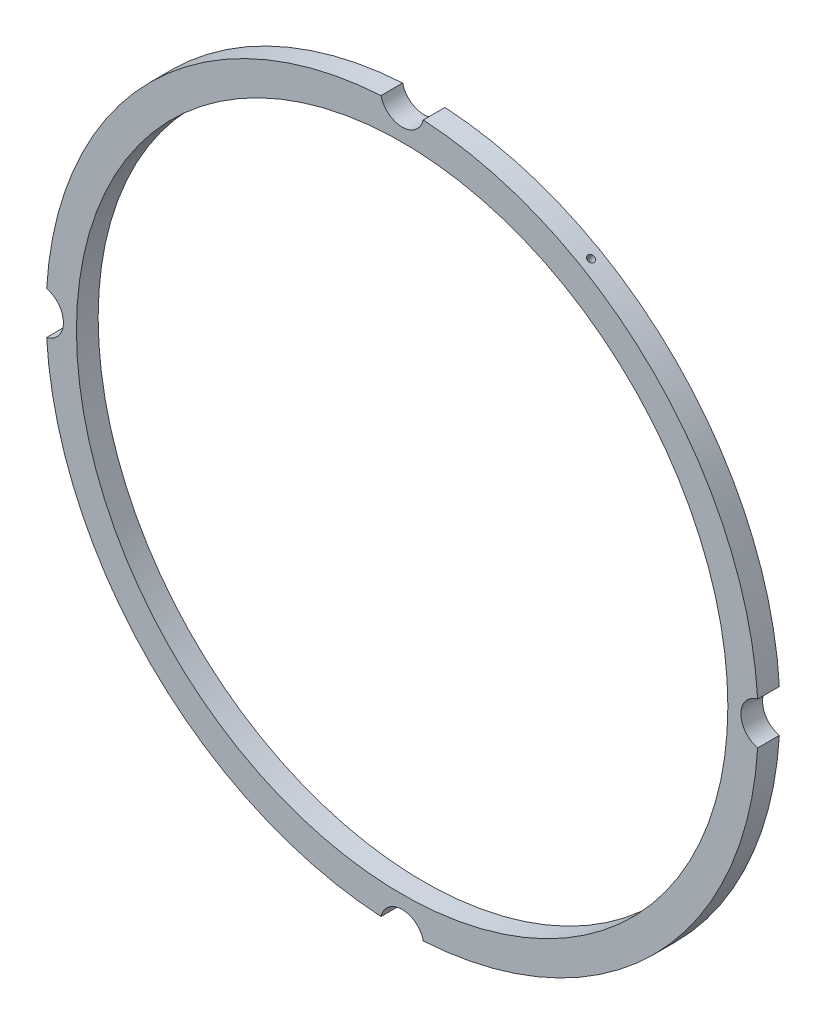
ISO-10303-21;
HEADER;
FILE_DESCRIPTION(('STEP AP214'),'2;1');
FILE_NAME('part.step','',(''),(''),'','','');
FILE_SCHEMA(('AUTOMOTIVE_DESIGN { 1 0 10303 214 1 1 1 1 }'));
ENDSEC;
DATA;
#1=APPLICATION_CONTEXT('core data for automotive mechanical design processes');
#2=APPLICATION_PROTOCOL_DEFINITION('international standard','automotive_design',2000,#1);
#3=PRODUCT_CONTEXT('',#1,'mechanical');
#4=PRODUCT('Part','Part','',(#3));
#5=PRODUCT_RELATED_PRODUCT_CATEGORY('part','',(#4));
#6=PRODUCT_DEFINITION_FORMATION('','',#4);
#7=PRODUCT_DEFINITION_CONTEXT('part definition',#1,'design');
#8=PRODUCT_DEFINITION('design','',#6,#7);
#9=PRODUCT_DEFINITION_SHAPE('','',#8);
#10=(LENGTH_UNIT() NAMED_UNIT(*) SI_UNIT(.MILLI.,.METRE.));
#11=(NAMED_UNIT(*) PLANE_ANGLE_UNIT() SI_UNIT($,.RADIAN.));
#12=(NAMED_UNIT(*) SI_UNIT($,.STERADIAN.) SOLID_ANGLE_UNIT());
#13=UNCERTAINTY_MEASURE_WITH_UNIT(LENGTH_MEASURE(1.E-05),#10,'distance_accuracy_value','');
#14=(GEOMETRIC_REPRESENTATION_CONTEXT(3) GLOBAL_UNCERTAINTY_ASSIGNED_CONTEXT((#13)) GLOBAL_UNIT_ASSIGNED_CONTEXT((#10,
#11,#12)) REPRESENTATION_CONTEXT('',''));
#15=CARTESIAN_POINT('',(0.,0.,0.));
#16=DIRECTION('',(0.,0.,1.));
#17=DIRECTION('',(1.,0.,0.));
#18=AXIS2_PLACEMENT_3D('',#15,#16,#17);
#19=CARTESIAN_POINT('',(0.,0.,5.));
#20=DIRECTION('',(0.,0.,-1.));
#21=DIRECTION('',(-1.,0.,0.));
#22=AXIS2_PLACEMENT_3D('',#19,#20,#21);
#23=CYLINDRICAL_SURFACE('',#22,82.);
#24=CARTESIAN_POINT('',(0.,0.,0.));
#25=DIRECTION('',(0.,0.,1.));
#26=DIRECTION('',(1.,0.,0.));
#27=AXIS2_PLACEMENT_3D('',#24,#25,#26);
#28=CIRCLE('',#27,82.);
#29=CARTESIAN_POINT('',(-4.86723129559619,81.855421686747,0.));
#30=VERTEX_POINT('',#29);
#31=CARTESIAN_POINT('',(-81.8554216867469,4.86723129559705,0.));
#32=VERTEX_POINT('',#31);
#33=EDGE_CURVE('E122',#30,#32,#28,.T.);
#34=ORIENTED_EDGE('',*,*,#33,.T.);
#35=DIRECTION('',(0.,0.,1.));
#36=VECTOR('',#35,1.);
#37=CARTESIAN_POINT('',(-81.8554216867469,4.86723129559704,2.5));
#38=LINE('',#37,#36);
#39=CARTESIAN_POINT('',(-81.8554216867469,4.86723129559704,5.));
#40=VERTEX_POINT('',#39);
#41=EDGE_CURVE('E55',#32,#40,#38,.T.);
#42=ORIENTED_EDGE('',*,*,#41,.T.);
#43=CARTESIAN_POINT('',(0.,0.,5.));
#44=DIRECTION('',(0.,0.,1.));
#45=DIRECTION('',(1.,0.,0.));
#46=AXIS2_PLACEMENT_3D('',#43,#44,#45);
#47=CIRCLE('',#46,82.);
#48=CARTESIAN_POINT('',(-4.86723129559619,81.855421686747,5.));
#49=VERTEX_POINT('',#48);
#50=EDGE_CURVE('E129',#49,#40,#47,.T.);
#51=ORIENTED_EDGE('',*,*,#50,.F.);
#52=DIRECTION('',(0.,0.,1.));
#53=VECTOR('',#52,1.);
#54=CARTESIAN_POINT('',(-4.86723129559619,81.855421686747,2.5));
#55=LINE('',#54,#53);
#56=EDGE_CURVE('E131',#49,#30,#55,.F.);
#57=ORIENTED_EDGE('',*,*,#56,.T.);
#58=EDGE_LOOP('',(#34,#42,#51,#57));
#59=FACE_BOUND('',#58,.T.);
#60=ADVANCED_FACE('F36',(#59),#23,.T.);
#61=CARTESIAN_POINT('',(-81.8554216867471,-4.86723129559533,5.));
#62=VERTEX_POINT('',#61);
#63=CARTESIAN_POINT('',(-4.86723129559619,-81.855421686747,5.));
#64=VERTEX_POINT('',#63);
#65=EDGE_CURVE('E115',#62,#64,#47,.T.);
#66=ORIENTED_EDGE('',*,*,#65,.F.);
#67=DIRECTION('',(0.,0.,1.));
#68=VECTOR('',#67,1.);
#69=CARTESIAN_POINT('',(-81.8554216867471,-4.86723129559533,2.5));
#70=LINE('',#69,#68);
#71=CARTESIAN_POINT('',(-81.8554216867471,-4.86723129559533,0.));
#72=VERTEX_POINT('',#71);
#73=EDGE_CURVE('E106',#62,#72,#70,.F.);
#74=ORIENTED_EDGE('',*,*,#73,.T.);
#75=CARTESIAN_POINT('',(-4.86723129559619,-81.855421686747,0.));
#76=VERTEX_POINT('',#75);
#77=EDGE_CURVE('E63',#72,#76,#28,.T.);
#78=ORIENTED_EDGE('',*,*,#77,.T.);
#79=DIRECTION('',(0.,0.,1.));
#80=VECTOR('',#79,1.);
#81=CARTESIAN_POINT('',(-4.86723129559619,-81.855421686747,2.5));
#82=LINE('',#81,#80);
#83=EDGE_CURVE('E160',#76,#64,#82,.T.);
#84=ORIENTED_EDGE('',*,*,#83,.T.);
#85=EDGE_LOOP('',(#66,#74,#78,#84));
#86=FACE_BOUND('',#85,.T.);
#87=ADVANCED_FACE('F114',(#86),#23,.T.);
#88=CARTESIAN_POINT('',(4.86723129559619,-81.855421686747,5.));
#89=VERTEX_POINT('',#88);
#90=CARTESIAN_POINT('',(81.855421686747,-4.86723129559647,5.));
#91=VERTEX_POINT('',#90);
#92=EDGE_CURVE('E145',#89,#91,#47,.T.);
#93=ORIENTED_EDGE('',*,*,#92,.F.);
#94=DIRECTION('',(0.,0.,1.));
#95=VECTOR('',#94,1.);
#96=CARTESIAN_POINT('',(4.86723129559619,-81.855421686747,2.5));
#97=LINE('',#96,#95);
#98=CARTESIAN_POINT('',(4.86723129559619,-81.855421686747,0.));
#99=VERTEX_POINT('',#98);
#100=EDGE_CURVE('E213',#89,#99,#97,.F.);
#101=ORIENTED_EDGE('',*,*,#100,.T.);
#102=CARTESIAN_POINT('',(81.855421686747,-4.86723129559647,0.));
#103=VERTEX_POINT('',#102);
#104=EDGE_CURVE('E123',#99,#103,#28,.T.);
#105=ORIENTED_EDGE('',*,*,#104,.T.);
#106=DIRECTION('',(0.,0.,1.));
#107=VECTOR('',#106,1.);
#108=CARTESIAN_POINT('',(81.855421686747,-4.86723129559647,2.5));
#109=LINE('',#108,#107);
#110=EDGE_CURVE('E48',#103,#91,#109,.T.);
#111=ORIENTED_EDGE('',*,*,#110,.T.);
#112=EDGE_LOOP('',(#93,#101,#105,#111));
#113=FACE_BOUND('',#112,.T.);
#114=ADVANCED_FACE('F143',(#113),#23,.T.);
#115=CARTESIAN_POINT('',(0.,0.,5.));
#116=DIRECTION('',(0.,0.,1.));
#117=DIRECTION('',(1.,0.,0.));
#118=AXIS2_PLACEMENT_3D('',#115,#116,#117);
#119=PLANE('',#118);
#120=CARTESIAN_POINT('',(-83.,8.6937885337194E-13,5.));
#121=DIRECTION('',(0.,0.,1.));
#122=DIRECTION('',(0.,1.,0.));
#123=AXIS2_PLACEMENT_3D('',#120,#121,#122);
#124=CIRCLE('',#123,5.);
#125=EDGE_CURVE('E111',#62,#40,#124,.T.);
#126=ORIENTED_EDGE('',*,*,#125,.F.);
#127=ORIENTED_EDGE('',*,*,#65,.T.);
#128=CARTESIAN_POINT('',(0.,-83.,5.));
#129=DIRECTION('',(0.,0.,1.));
#130=DIRECTION('',(-1.,0.,0.));
#131=AXIS2_PLACEMENT_3D('',#128,#129,#130);
#132=CIRCLE('',#131,5.);
#133=EDGE_CURVE('E205',#89,#64,#132,.T.);
#134=ORIENTED_EDGE('',*,*,#133,.F.);
#135=ORIENTED_EDGE('',*,*,#92,.T.);
#136=CARTESIAN_POINT('',(83.,-2.8979295112398E-13,5.));
#137=DIRECTION('',(0.,0.,1.));
#138=DIRECTION('',(0.,-1.,0.));
#139=AXIS2_PLACEMENT_3D('',#136,#137,#138);
#140=CIRCLE('',#139,5.);
#141=CARTESIAN_POINT('',(81.855421686747,4.8672312955959,5.));
#142=VERTEX_POINT('',#141);
#143=EDGE_CURVE('E152',#142,#91,#140,.T.);
#144=ORIENTED_EDGE('',*,*,#143,.F.);
#145=CARTESIAN_POINT('',(4.86723129559619,81.855421686747,5.));
#146=VERTEX_POINT('',#145);
#147=EDGE_CURVE('E125',#142,#146,#47,.T.);
#148=ORIENTED_EDGE('',*,*,#147,.T.);
#149=CARTESIAN_POINT('',(0.,83.,5.));
#150=DIRECTION('',(0.,0.,1.));
#151=DIRECTION('',(1.,0.,0.));
#152=AXIS2_PLACEMENT_3D('',#149,#150,#151);
#153=CIRCLE('',#152,5.);
#154=EDGE_CURVE('E155',#49,#146,#153,.T.);
#155=ORIENTED_EDGE('',*,*,#154,.F.);
#156=ORIENTED_EDGE('',*,*,#50,.T.);
#157=EDGE_LOOP('',(#126,#127,#134,#135,#144,#148,#155,#156));
#158=FACE_BOUND('',#157,.T.);
#159=CARTESIAN_POINT('',(0.,0.,5.));
#160=DIRECTION('',(0.,0.,1.));
#161=DIRECTION('',(1.,0.,0.));
#162=AXIS2_PLACEMENT_3D('',#159,#160,#161);
#163=CIRCLE('',#162,75.);
#164=CARTESIAN_POINT('',(75.,0.,5.));
#165=VERTEX_POINT('',#164);
#166=EDGE_CURVE('E167',#165,#165,#163,.T.);
#167=ORIENTED_EDGE('',*,*,#166,.F.);
#168=EDGE_LOOP('',(#167));
#169=FACE_BOUND('',#168,.T.);
#170=ADVANCED_FACE('F201',(#158,#169),#119,.T.);
#171=CARTESIAN_POINT('',(0.,0.,0.));
#172=DIRECTION('',(0.,0.,1.));
#173=DIRECTION('',(1.,0.,0.));
#174=AXIS2_PLACEMENT_3D('',#171,#172,#173);
#175=PLANE('',#174);
#176=ORIENTED_EDGE('',*,*,#77,.F.);
#177=CARTESIAN_POINT('',(-83.,8.6937885337194E-13,0.));
#178=DIRECTION('',(0.,0.,1.));
#179=DIRECTION('',(0.,1.,0.));
#180=AXIS2_PLACEMENT_3D('',#177,#178,#179);
#181=CIRCLE('',#180,5.);
#182=EDGE_CURVE('E104',#72,#32,#181,.T.);
#183=ORIENTED_EDGE('',*,*,#182,.T.);
#184=ORIENTED_EDGE('',*,*,#33,.F.);
#185=CARTESIAN_POINT('',(0.,83.,0.));
#186=DIRECTION('',(0.,0.,1.));
#187=DIRECTION('',(1.,0.,0.));
#188=AXIS2_PLACEMENT_3D('',#185,#186,#187);
#189=CIRCLE('',#188,5.);
#190=CARTESIAN_POINT('',(4.86723129559619,81.855421686747,0.));
#191=VERTEX_POINT('',#190);
#192=EDGE_CURVE('E158',#30,#191,#189,.T.);
#193=ORIENTED_EDGE('',*,*,#192,.T.);
#194=CARTESIAN_POINT('',(81.855421686747,4.8672312955959,0.));
#195=VERTEX_POINT('',#194);
#196=EDGE_CURVE('E126',#195,#191,#28,.T.);
#197=ORIENTED_EDGE('',*,*,#196,.F.);
#198=CARTESIAN_POINT('',(83.,-2.8979295112398E-13,0.));
#199=DIRECTION('',(0.,0.,1.));
#200=DIRECTION('',(0.,-1.,0.));
#201=AXIS2_PLACEMENT_3D('',#198,#199,#200);
#202=CIRCLE('',#201,5.);
#203=EDGE_CURVE('E150',#195,#103,#202,.T.);
#204=ORIENTED_EDGE('',*,*,#203,.T.);
#205=ORIENTED_EDGE('',*,*,#104,.F.);
#206=CARTESIAN_POINT('',(0.,-83.,0.));
#207=DIRECTION('',(0.,0.,1.));
#208=DIRECTION('',(-1.,0.,0.));
#209=AXIS2_PLACEMENT_3D('',#206,#207,#208);
#210=CIRCLE('',#209,5.);
#211=EDGE_CURVE('E121',#99,#76,#210,.T.);
#212=ORIENTED_EDGE('',*,*,#211,.T.);
#213=EDGE_LOOP('',(#176,#183,#184,#193,#197,#204,#205,#212));
#214=FACE_BOUND('',#213,.T.);
#215=CARTESIAN_POINT('',(0.,0.,0.));
#216=DIRECTION('',(0.,0.,1.));
#217=DIRECTION('',(1.,0.,0.));
#218=AXIS2_PLACEMENT_3D('',#215,#216,#217);
#219=CIRCLE('',#218,75.);
#220=CARTESIAN_POINT('',(75.,0.,0.));
#221=VERTEX_POINT('',#220);
#222=EDGE_CURVE('E165',#221,#221,#219,.T.);
#223=ORIENTED_EDGE('',*,*,#222,.T.);
#224=EDGE_LOOP('',(#223));
#225=FACE_BOUND('',#224,.T.);
#226=ADVANCED_FACE('F118',(#214,#225),#175,.F.);
#227=CARTESIAN_POINT('',(40.3052284110281,71.4107034185693,2.5));
#228=CARTESIAN_POINT('',(40.305230162785,71.4107024681233,2.45506479609301));
#229=CARTESIAN_POINT('',(40.3085368078791,71.40883642493,2.41009703714875));
#230=CARTESIAN_POINT('',(40.3216802135916,71.4014156688339,2.32140003350558));
#231=CARTESIAN_POINT('',(40.3315248278901,71.3958565196163,2.2776723443821));
#232=CARTESIAN_POINT('',(40.3574592527584,71.3811999286591,2.19275330768963));
#233=CARTESIAN_POINT('',(40.3735460727166,71.3721041812829,2.1515607564808));
#234=CARTESIAN_POINT('',(40.4114971299767,71.3506227921757,2.07287429083479));
#235=CARTESIAN_POINT('',(40.4333599334488,71.3382379669211,2.03537946164327));
#236=CARTESIAN_POINT('',(40.4822388609424,71.3105120161913,1.96513443541361));
#237=CARTESIAN_POINT('',(40.5092556770344,71.2951704936937,1.93238487660122));
#238=CARTESIAN_POINT('',(40.5676657214676,71.2619507473826,1.87256517048709));
#239=CARTESIAN_POINT('',(40.59905912185,71.2440724238483,1.84549524655357));
#240=CARTESIAN_POINT('',(40.6653214679689,71.2062713712898,1.79780471692709));
#241=CARTESIAN_POINT('',(40.7001904182244,71.1863486396075,1.77718411961991));
#242=CARTESIAN_POINT('',(40.772406334745,71.1450111456783,1.74297779787521));
#243=CARTESIAN_POINT('',(40.8097532955037,71.1235963867468,1.72939205780613));
#244=CARTESIAN_POINT('',(40.8858585322044,71.0798740635081,1.7096414437845));
#245=CARTESIAN_POINT('',(40.9246167652487,71.0575665263361,1.70347634446411));
#246=CARTESIAN_POINT('',(41.0024427076472,71.0126869615936,1.69874133559804));
#247=CARTESIAN_POINT('',(41.0415104163721,70.9901149345609,1.70017141060813));
#248=CARTESIAN_POINT('',(41.1188455717403,70.945348935138,1.71058592631372));
#249=CARTESIAN_POINT('',(41.1571130452983,70.9231549500377,1.71957011251892));
#250=CARTESIAN_POINT('',(41.2317665366884,70.8797805669154,1.74483743505819));
#251=CARTESIAN_POINT('',(41.2681525523058,70.8586001700864,1.76112057998316));
#252=CARTESIAN_POINT('',(41.3380172194721,70.8178647619419,1.8005238820961));
#253=CARTESIAN_POINT('',(41.3714958216182,70.7983097782456,1.82364415543102));
#254=CARTESIAN_POINT('',(41.434603016724,70.7613949232539,1.87606530348474));
#255=CARTESIAN_POINT('',(41.4642316101463,70.7440350516948,1.90536617746083));
#256=CARTESIAN_POINT('',(41.5188083007377,70.7120185025764,1.96931822819109));
#257=CARTESIAN_POINT('',(41.5437562021976,70.6973619380483,2.0039696285513));
#258=CARTESIAN_POINT('',(41.5882710512857,70.6711849340483,2.07763829735254));
#259=CARTESIAN_POINT('',(41.6078379981956,70.6596644949952,2.11665556637642));
#260=CARTESIAN_POINT('',(41.641043626485,70.640100926749,2.19794850712354));
#261=CARTESIAN_POINT('',(41.6546823022913,70.6320578008251,2.24022418191001));
#262=CARTESIAN_POINT('',(41.6756502729947,70.6196879331484,2.3268337992777));
#263=CARTESIAN_POINT('',(41.6829795699621,70.6153611901761,2.37116774118354));
#264=CARTESIAN_POINT('',(41.6911239668386,70.6105530728755,2.46063342804992));
#265=CARTESIAN_POINT('',(41.6919393353669,70.6100715399797,2.50576514003536));
#266=CARTESIAN_POINT('',(41.6870338226723,70.6129677812092,2.59554693556317));
#267=CARTESIAN_POINT('',(41.6813129419862,70.6163455550177,2.64019701914508));
#268=CARTESIAN_POINT('',(41.6634948178797,70.6268596602105,2.72774720890134));
#269=CARTESIAN_POINT('',(41.6513976958952,70.6339959200141,2.77064734838672));
#270=CARTESIAN_POINT('',(41.6211650638207,70.6518147314161,2.8534808607507));
#271=CARTESIAN_POINT('',(41.6030295531477,70.6624972833568,2.89341423334282));
#272=CARTESIAN_POINT('',(41.5612265203059,70.6870924286367,2.969182062557));
#273=CARTESIAN_POINT('',(41.537558817141,70.7010051276562,3.00501638501377));
#274=CARTESIAN_POINT('',(41.4853544455829,70.7316497769729,3.07156755198846));
#275=CARTESIAN_POINT('',(41.4568177741148,70.7483817290505,3.10228439327473));
#276=CARTESIAN_POINT('',(41.3956750206665,70.7841743762166,3.15772966893017));
#277=CARTESIAN_POINT('',(41.3630688010143,70.8032351500882,3.18245790062276));
#278=CARTESIAN_POINT('',(41.2947046718655,70.8431290267123,3.22522259144113));
#279=CARTESIAN_POINT('',(41.2589467660966,70.8639621273686,3.24325905848161));
#280=CARTESIAN_POINT('',(41.1852880913143,70.9067969831621,3.27212789441348));
#281=CARTESIAN_POINT('',(41.1473873619883,70.9287987166545,3.28296039668251));
#282=CARTESIAN_POINT('',(41.0705139344065,70.9733390629306,3.2971142516783));
#283=CARTESIAN_POINT('',(41.0315412345227,70.9958776765296,3.30043559299622));
#284=CARTESIAN_POINT('',(40.9536306752187,71.0408485140235,3.29947279646205));
#285=CARTESIAN_POINT('',(40.9146928143604,71.0632807424909,3.2951889885238));
#286=CARTESIAN_POINT('',(40.8379572703114,71.1074061241529,3.27913815237901));
#287=CARTESIAN_POINT('',(40.8001595894107,71.129099275863,3.26737110914376));
#288=CARTESIAN_POINT('',(40.7267814451327,71.1711392536284,3.23668763250792));
#289=CARTESIAN_POINT('',(40.6912010228659,71.1914860547211,3.21777106659268));
#290=CARTESIAN_POINT('',(40.6232765406942,71.2302669838026,3.17332635454546));
#291=CARTESIAN_POINT('',(40.5909323548439,71.2487011862253,3.1477984658466));
#292=CARTESIAN_POINT('',(40.5304074104666,71.2831487094411,3.09085755066492));
#293=CARTESIAN_POINT('',(40.5022263893502,71.2991621829217,3.05944489564428));
#294=CARTESIAN_POINT('',(40.4508278504761,71.328335198352,2.99161477008843));
#295=CARTESIAN_POINT('',(40.4276115676375,71.3414940302556,2.95519605804873));
#296=CARTESIAN_POINT('',(40.3868099222115,71.3646000206399,2.87838044791628));
#297=CARTESIAN_POINT('',(40.3692273551643,71.3745455846659,2.83798158776968));
#298=CARTESIAN_POINT('',(40.340231691055,71.3909377104108,2.75439747070504));
#299=CARTESIAN_POINT('',(40.3288112020707,71.3973884644812,2.71121562216789));
#300=CARTESIAN_POINT('',(40.3155112248783,71.4048988976244,2.63979902324666));
#301=CARTESIAN_POINT('',(40.3116600520628,71.4070729879977,2.61202827082365));
#302=CARTESIAN_POINT('',(40.3065180975612,71.4099755455663,2.55617592082972));
#303=CARTESIAN_POINT('',(40.3052273157971,71.4107040128057,2.52809432326828));
#304=CARTESIAN_POINT('',(40.3052284110281,71.4107034185693,2.5));
#305=B_SPLINE_CURVE_WITH_KNOTS('',3,(#227,#228,#229,#230,#231,#232,#233,#234,#235,#236,#237,
#238,#239,#240,#241,#242,#243,#244,#245,#246,#247,#248,#249,#250,#251,#252,#253,#254,#255,#256,
#257,#258,#259,#260,#261,#262,#263,#264,#265,#266,#267,#268,#269,#270,#271,#272,#273,#274,#275,
#276,#277,#278,#279,#280,#281,#282,#283,#284,#285,#286,#287,#288,#289,#290,#291,#292,#293,#294,
#295,#296,#297,#298,#299,#300,#301,#302,#303,#304),.UNSPECIFIED.,.T.,.F.,(4,2,2,2,2,2,2,2,2,2,2,
2,2,2,2,2,2,2,2,2,2,2,2,2,2,2,2,2,2,2,2,2,2,2,2,2,2,2,4),(0.,0.134703067123948,
0.269568238553243,0.404368876326949,0.539136082591836,0.673921397882166,0.808712013005295,
0.943502803389995,1.07829329426615,1.21307969139774,1.3478658144514,1.48264739688011,
1.61742913794746,1.75221316877517,1.88699718340583,2.02178683237556,2.15657649934035,
2.29136629302325,2.42615604247801,2.56094023348926,2.69572441343268,2.83050602649565,
2.96528765257392,3.10007368890395,3.23485981034965,3.36965049281607,3.50444101585781,
3.63922904325403,3.77401727538224,3.90879966049612,4.04358231629641,4.17836747038272,
4.31314737696438,4.44791877874288,4.58272366439787,4.71759533917827,4.85230486249336,
4.93652372208246,5.02074257910249),.UNSPECIFIED.);
#306=CARTESIAN_POINT('',(40.3052284110281,71.4107034185693,2.5));
#307=VERTEX_POINT('',#306);
#308=EDGE_CURVE('E11',#307,#307,#305,.T.);
#309=ORIENTED_EDGE('',*,*,#308,.T.);
#310=EDGE_LOOP('',(#309));
#311=FACE_BOUND('',#310,.T.);
#312=ORIENTED_EDGE('',*,*,#147,.F.);
#313=DIRECTION('',(0.,0.,1.));
#314=VECTOR('',#313,1.);
#315=CARTESIAN_POINT('',(81.855421686747,4.8672312955959,2.5));
#316=LINE('',#315,#314);
#317=EDGE_CURVE('E137',#142,#195,#316,.F.);
#318=ORIENTED_EDGE('',*,*,#317,.T.);
#319=ORIENTED_EDGE('',*,*,#196,.T.);
#320=DIRECTION('',(0.,0.,1.));
#321=VECTOR('',#320,1.);
#322=CARTESIAN_POINT('',(4.86723129559619,81.855421686747,2.5));
#323=LINE('',#322,#321);
#324=EDGE_CURVE('E134',#191,#146,#323,.T.);
#325=ORIENTED_EDGE('',*,*,#324,.T.);
#326=EDGE_LOOP('',(#312,#318,#319,#325));
#327=FACE_BOUND('',#326,.T.);
#328=ADVANCED_FACE('F38',(#311,#327),#23,.T.);
#329=CARTESIAN_POINT('',(0.,0.,5.));
#330=DIRECTION('',(0.,0.,-1.));
#331=DIRECTION('',(-1.,0.,0.));
#332=AXIS2_PLACEMENT_3D('',#329,#330,#331);
#333=CYLINDRICAL_SURFACE('',#332,75.);
#334=CARTESIAN_POINT('',(36.8050462829542,65.3482101370007,2.5));
#335=CARTESIAN_POINT('',(36.8050480371068,65.3482091908556,2.4550650202504));
#336=CARTESIAN_POINT('',(36.8083563893281,65.3463461799556,2.41009749094246));
#337=CARTESIAN_POINT('',(36.8215064307599,65.3389372344705,2.32140095562176));
#338=CARTESIAN_POINT('',(36.8313559762903,65.3333868711768,2.27767350494019));
#339=CARTESIAN_POINT('',(36.8573029001601,65.3187526175866,2.19275494634586));
#340=CARTESIAN_POINT('',(36.8733972851322,65.3096704202157,2.15156263419737));
#341=CARTESIAN_POINT('',(36.9113652327449,65.2882193796654,2.07287659923403));
#342=CARTESIAN_POINT('',(36.9332373616623,65.275851351847,2.035381962022));
#343=CARTESIAN_POINT('',(36.9821357786632,65.2481602840425,1.96513702906338));
#344=CARTESIAN_POINT('',(37.0091627888349,65.2328368300614,1.93238739912278));
#345=CARTESIAN_POINT('',(37.0675928290538,65.1996525164563,1.87256749931847));
#346=CARTESIAN_POINT('',(37.0989960311762,65.1817915570551,1.84549745288538));
#347=CARTESIAN_POINT('',(37.165276621277,65.1440224914367,1.79780653018475));
#348=CARTESIAN_POINT('',(37.2001540272983,65.1241143745878,1.77718568741294));
#349=CARTESIAN_POINT('',(37.2723844475244,65.0828017747338,1.74297889347224));
#350=CARTESIAN_POINT('',(37.309737456126,65.0613972951156,1.72939292638149));
#351=CARTESIAN_POINT('',(37.385851456047,65.0176901750221,1.70964196631049));
#352=CARTESIAN_POINT('',(37.4246123956756,64.9953875675174,1.70347670116969));
#353=CARTESIAN_POINT('',(37.5024403148383,64.9505118372576,1.69874132894006));
#354=CARTESIAN_POINT('',(37.541507293736,64.9279387150649,1.70017120606365));
#355=CARTESIAN_POINT('',(37.6188373554944,64.8831647861721,1.71058526118988));
#356=CARTESIAN_POINT('',(37.6571004707224,64.8609639644887,1.71956913443268));
#357=CARTESIAN_POINT('',(37.7317423544195,64.8175707954564,1.74483569725781));
#358=CARTESIAN_POINT('',(37.7681211206258,64.7963784493184,1.76111839560381));
#359=CARTESIAN_POINT('',(37.8379693340923,64.7556153066755,1.8005207415664));
#360=CARTESIAN_POINT('',(37.8714387220741,64.7360445432105,1.82364052844561));
#361=CARTESIAN_POINT('',(37.934526459754,64.6990961367939,1.8760606377374));
#362=CARTESIAN_POINT('',(37.9641448097006,64.6817184937006,1.90536095975093));
#363=CARTESIAN_POINT('',(38.0187013917973,64.6496662631315,1.96931214094038));
#364=CARTESIAN_POINT('',(38.0436393901331,64.6349918106984,2.00396326726652));
#365=CARTESIAN_POINT('',(38.0881356631969,64.6087810653332,2.07763147675292));
#366=CARTESIAN_POINT('',(38.1076939372037,64.597244772822,2.11664856049856));
#367=CARTESIAN_POINT('',(38.1408844541449,64.5776533045459,2.19794124937333));
#368=CARTESIAN_POINT('',(38.1545166903565,64.5695981327303,2.24021685819908));
#369=CARTESIAN_POINT('',(38.1754747513236,64.5572093338679,2.32682645392057));
#370=CARTESIAN_POINT('',(38.1828005784973,64.5528757053942,2.37116044002703));
#371=CARTESIAN_POINT('',(38.1909413824111,64.5480597632868,2.46062594210085));
#372=CARTESIAN_POINT('',(38.1917566800836,64.5475772598144,2.50575741864649));
#373=CARTESIAN_POINT('',(38.186854547518,64.5504775161813,2.59553881341012));
#374=CARTESIAN_POINT('',(38.1811371179785,64.5538602756073,2.64018873167963));
#375=CARTESIAN_POINT('',(38.1633291083601,64.5643896994272,2.72773849669129));
#376=CARTESIAN_POINT('',(38.1512386734367,64.5715362780939,2.77063838326933));
#377=CARTESIAN_POINT('',(38.121021943817,64.58937987047,2.85347150366393));
#378=CARTESIAN_POINT('',(38.1028956482698,64.6000768846797,2.89340473706236));
#379=CARTESIAN_POINT('',(38.0611124544012,64.6247035165116,2.96917268708774));
#380=CARTESIAN_POINT('',(38.0374553396379,64.6386332606425,3.00500724323626));
#381=CARTESIAN_POINT('',(37.9852724588776,64.6693125821188,3.07155900623288));
#382=CARTESIAN_POINT('',(37.9567466895903,64.6860621613697,3.10227620962269));
#383=CARTESIAN_POINT('',(37.8956246465006,64.7218887639564,3.1577225312695));
#384=CARTESIAN_POINT('',(37.863028208343,64.7409658812668,3.1824514076266));
#385=CARTESIAN_POINT('',(37.7946816007971,64.7808892105927,3.22521742401462));
#386=CARTESIAN_POINT('',(37.7589314352171,64.8017354204719,3.2432545721263));
#387=CARTESIAN_POINT('',(37.6852854659991,64.8445917012878,3.27212471767836));
#388=CARTESIAN_POINT('',(37.6473897097049,64.8666017465431,3.28295787401225));
#389=CARTESIAN_POINT('',(37.570522798859,64.9111530416104,3.29711304961452));
#390=CARTESIAN_POINT('',(37.5315516427333,64.9336942922,3.30043505788946));
#391=CARTESIAN_POINT('',(37.4536409057876,64.9786642363913,3.29947358692462));
#392=CARTESIAN_POINT('',(37.4147013234452,65.0010929357281,3.29519049922343));
#393=CARTESIAN_POINT('',(37.3379589704716,65.0452056620496,3.27914120179627));
#394=CARTESIAN_POINT('',(37.3001562021231,65.0668896875391,3.26737497704569));
#395=CARTESIAN_POINT('',(37.2267650922114,65.1089068431069,3.2366932260097));
#396=CARTESIAN_POINT('',(37.1911767916611,65.1292399481661,3.21777756735918));
#397=CARTESIAN_POINT('',(37.1232346218809,65.1679904761977,3.17333473728468));
#398=CARTESIAN_POINT('',(37.0908806269882,65.1864079735984,3.1478078228667));
#399=CARTESIAN_POINT('',(37.0303349483126,65.2208211267837,3.09086865031063));
#400=CARTESIAN_POINT('',(37.0021430357465,65.236816915687,3.05945671587823));
#401=CARTESIAN_POINT('',(36.9507230753817,65.2659554454819,2.99162792346798));
#402=CARTESIAN_POINT('',(36.9274962624952,65.2790974766038,2.95520982405612));
#403=CARTESIAN_POINT('',(36.886674973326,65.3021727146869,2.87839515111329));
#404=CARTESIAN_POINT('',(36.8690833131314,65.3121043173042,2.83799660155311));
#405=CARTESIAN_POINT('',(36.8400719807352,65.3284729390554,2.75441290469289));
#406=CARTESIAN_POINT('',(36.8286449144051,65.3349141447912,2.71123116563503));
#407=CARTESIAN_POINT('',(36.8153363830033,65.3424137824977,2.63981210935176));
#408=CARTESIAN_POINT('',(36.8114824882576,65.3445848245014,2.61203879602761));
#409=CARTESIAN_POINT('',(36.8063368898609,65.3474832975298,2.55618123049377));
#410=CARTESIAN_POINT('',(36.8050451861163,65.3482107286071,2.52809697829542));
#411=CARTESIAN_POINT('',(36.8050462829542,65.3482101370007,2.5));
#412=B_SPLINE_CURVE_WITH_KNOTS('',3,(#334,#335,#336,#337,#338,#339,#340,#341,#342,#343,#344,
#345,#346,#347,#348,#349,#350,#351,#352,#353,#354,#355,#356,#357,#358,#359,#360,#361,#362,#363,
#364,#365,#366,#367,#368,#369,#370,#371,#372,#373,#374,#375,#376,#377,#378,#379,#380,#381,#382,
#383,#384,#385,#386,#387,#388,#389,#390,#391,#392,#393,#394,#395,#396,#397,#398,#399,#400,#401,
#402,#403,#404,#405,#406,#407,#408,#409,#410,#411),.UNSPECIFIED.,.T.,.F.,(4,2,2,2,2,2,2,2,2,2,2,
2,2,2,2,2,2,2,2,2,2,2,2,2,2,2,2,2,2,2,2,2,2,2,2,2,2,2,4),(0.,0.134702384884244,
0.269566847771312,0.40436674516063,0.53913322388388,0.67391859438231,0.808709266243902,
0.94350063816686,1.07829170501871,1.21307782814302,1.34786367109516,1.48264407648283,
1.61742464370115,1.7522079564138,1.88699126042393,2.02178129595248,2.15657134955319,
2.29136155606754,2.42615171089691,2.56093522128894,2.69571871726383,2.83049914345485,
2.9652795886429,3.10006530918114,3.23485112080662,3.36964237622916,3.50443346888081,
3.63922158843895,3.77400990527481,3.90879128290842,4.04357293115627,4.17835707488296,
4.31313597979601,4.44790747336685,4.5827124482066,4.71758468521554,4.85229478784963,
4.93652160053774,5.02074841015296),.UNSPECIFIED.);
#413=CARTESIAN_POINT('',(36.8050462829542,65.3482101370007,2.5));
#414=VERTEX_POINT('',#413);
#415=EDGE_CURVE('E206',#414,#414,#412,.T.);
#416=ORIENTED_EDGE('',*,*,#415,.F.);
#417=EDGE_LOOP('',(#416));
#418=FACE_BOUND('',#417,.T.);
#419=ORIENTED_EDGE('',*,*,#166,.T.);
#420=EDGE_LOOP('',(#419));
#421=FACE_BOUND('',#420,.T.);
#422=ORIENTED_EDGE('',*,*,#222,.F.);
#423=EDGE_LOOP('',(#422));
#424=FACE_BOUND('',#423,.T.);
#425=ADVANCED_FACE('F172',(#418,#421,#424),#333,.F.);
#426=CARTESIAN_POINT('',(0.,83.,0.));
#427=DIRECTION('',(0.,0.,1.));
#428=DIRECTION('',(1.,0.,0.));
#429=AXIS2_PLACEMENT_3D('',#426,#427,#428);
#430=CYLINDRICAL_SURFACE('',#429,5.);
#431=ORIENTED_EDGE('',*,*,#192,.F.);
#432=ORIENTED_EDGE('',*,*,#56,.F.);
#433=ORIENTED_EDGE('',*,*,#154,.T.);
#434=ORIENTED_EDGE('',*,*,#324,.F.);
#435=EDGE_LOOP('',(#431,#432,#433,#434));
#436=FACE_BOUND('',#435,.T.);
#437=ADVANCED_FACE('F174',(#436),#430,.F.);
#438=CARTESIAN_POINT('',(83.,-2.8979295112398E-13,0.));
#439=DIRECTION('',(0.,0.,1.));
#440=DIRECTION('',(1.,0.,0.));
#441=AXIS2_PLACEMENT_3D('',#438,#439,#440);
#442=CYLINDRICAL_SURFACE('',#441,5.);
#443=ORIENTED_EDGE('',*,*,#203,.F.);
#444=ORIENTED_EDGE('',*,*,#317,.F.);
#445=ORIENTED_EDGE('',*,*,#143,.T.);
#446=ORIENTED_EDGE('',*,*,#110,.F.);
#447=EDGE_LOOP('',(#443,#444,#445,#446));
#448=FACE_BOUND('',#447,.T.);
#449=ADVANCED_FACE('F149',(#448),#442,.F.);
#450=CARTESIAN_POINT('',(0.,-83.,0.));
#451=DIRECTION('',(0.,0.,1.));
#452=DIRECTION('',(1.,0.,0.));
#453=AXIS2_PLACEMENT_3D('',#450,#451,#452);
#454=CYLINDRICAL_SURFACE('',#453,5.);
#455=ORIENTED_EDGE('',*,*,#211,.F.);
#456=ORIENTED_EDGE('',*,*,#100,.F.);
#457=ORIENTED_EDGE('',*,*,#133,.T.);
#458=ORIENTED_EDGE('',*,*,#83,.F.);
#459=EDGE_LOOP('',(#455,#456,#457,#458));
#460=FACE_BOUND('',#459,.T.);
#461=ADVANCED_FACE('F215',(#460),#454,.F.);
#462=CARTESIAN_POINT('',(-83.,8.6937885337194E-13,0.));
#463=DIRECTION('',(0.,0.,1.));
#464=DIRECTION('',(1.,0.,0.));
#465=AXIS2_PLACEMENT_3D('',#462,#463,#464);
#466=CYLINDRICAL_SURFACE('',#465,5.);
#467=ORIENTED_EDGE('',*,*,#182,.F.);
#468=ORIENTED_EDGE('',*,*,#73,.F.);
#469=ORIENTED_EDGE('',*,*,#125,.T.);
#470=ORIENTED_EDGE('',*,*,#41,.F.);
#471=EDGE_LOOP('',(#467,#468,#469,#470));
#472=FACE_BOUND('',#471,.T.);
#473=ADVANCED_FACE('F105',(#472),#466,.F.);
#474=CARTESIAN_POINT('',(41.,71.014083110324,2.5));
#475=DIRECTION('',(0.5,0.866025403784439,0.));
#476=DIRECTION('',(-0.866025403784439,0.5,0.));
#477=AXIS2_PLACEMENT_3D('',#474,#475,#476);
#478=CYLINDRICAL_SURFACE('',#477,0.799999999999994);
#479=ORIENTED_EDGE('',*,*,#415,.T.);
#480=EDGE_LOOP('',(#479));
#481=FACE_BOUND('',#480,.T.);
#482=ORIENTED_EDGE('',*,*,#308,.F.);
#483=EDGE_LOOP('',(#482));
#484=FACE_BOUND('',#483,.T.);
#485=ADVANCED_FACE('F222',(#481,#484),#478,.F.);
#486=CLOSED_SHELL('',(#60,#87,#114,#170,#226,#328,#425,#437,#449,#461,#473,#485));
#487=MANIFOLD_SOLID_BREP('B2',#486);
#488=ADVANCED_BREP_SHAPE_REPRESENTATION('',(#18,#487),#14);
#489=SHAPE_DEFINITION_REPRESENTATION(#9,#488);
ENDSEC;
END-ISO-10303-21;
